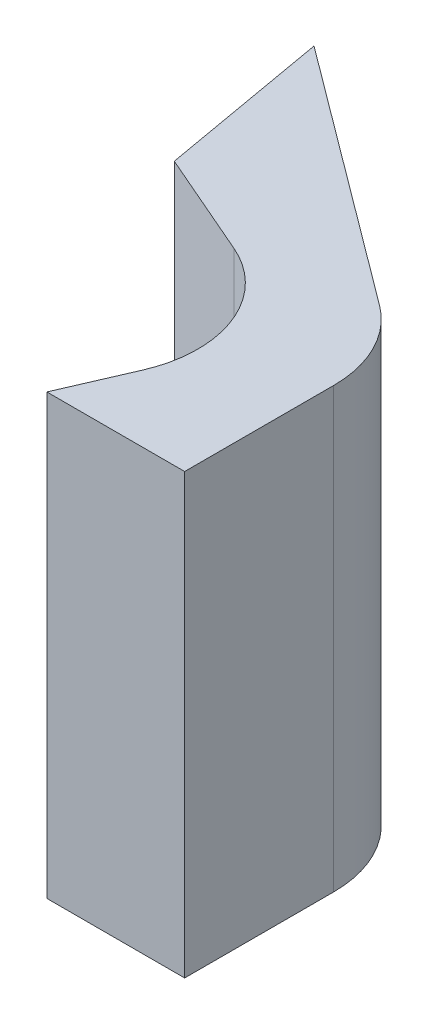
ISO-10303-21;
HEADER;
FILE_DESCRIPTION(('STEP AP214'),'2;1');
FILE_NAME('part.step','',(''),(''),'','','');
FILE_SCHEMA(('AUTOMOTIVE_DESIGN { 1 0 10303 214 1 1 1 1 }'));
ENDSEC;
DATA;
#1=APPLICATION_CONTEXT('core data for automotive mechanical design processes');
#2=APPLICATION_PROTOCOL_DEFINITION('international standard','automotive_design',2000,#1);
#3=PRODUCT_CONTEXT('',#1,'mechanical');
#4=PRODUCT('Part','Part','',(#3));
#5=PRODUCT_RELATED_PRODUCT_CATEGORY('part','',(#4));
#6=PRODUCT_DEFINITION_FORMATION('','',#4);
#7=PRODUCT_DEFINITION_CONTEXT('part definition',#1,'design');
#8=PRODUCT_DEFINITION('design','',#6,#7);
#9=PRODUCT_DEFINITION_SHAPE('','',#8);
#10=(LENGTH_UNIT() NAMED_UNIT(*) SI_UNIT(.MILLI.,.METRE.));
#11=(NAMED_UNIT(*) PLANE_ANGLE_UNIT() SI_UNIT($,.RADIAN.));
#12=(NAMED_UNIT(*) SI_UNIT($,.STERADIAN.) SOLID_ANGLE_UNIT());
#13=UNCERTAINTY_MEASURE_WITH_UNIT(LENGTH_MEASURE(1.E-05),#10,'distance_accuracy_value','');
#14=(GEOMETRIC_REPRESENTATION_CONTEXT(3) GLOBAL_UNCERTAINTY_ASSIGNED_CONTEXT((#13)) GLOBAL_UNIT_ASSIGNED_CONTEXT((#10,
#11,#12)) REPRESENTATION_CONTEXT('',''));
#15=CARTESIAN_POINT('',(0.,0.,0.));
#16=DIRECTION('',(0.,0.,1.));
#17=DIRECTION('',(1.,0.,0.));
#18=AXIS2_PLACEMENT_3D('',#15,#16,#17);
#19=CARTESIAN_POINT('',(2.52335611115016,38.2,-5.82418169498388));
#20=DIRECTION('',(0.917581830501602,0.,0.397546958651841));
#21=DIRECTION('',(0.397546958651842,0.,-0.917581830501602));
#22=AXIS2_PLACEMENT_3D('',#19,#20,#21);
#23=PLANE('',#22);
#24=DIRECTION('',(-0.397546958651841,0.,0.917581830501602));
#25=VECTOR('',#24,1.);
#26=CARTESIAN_POINT('',(2.52335611115016,0.,-5.82418169498388));
#27=LINE('',#26,#25);
#28=CARTESIAN_POINT('',(2.52335611115016,0.,-5.82418169498388));
#29=VERTEX_POINT('',#28);
#30=CARTESIAN_POINT('',(0.,0.,0.));
#31=VERTEX_POINT('',#30);
#32=EDGE_CURVE('E131',#29,#31,#27,.T.);
#33=ORIENTED_EDGE('',*,*,#32,.T.);
#34=DIRECTION('',(0.,-1.,0.));
#35=VECTOR('',#34,1.);
#36=CARTESIAN_POINT('',(0.,38.2,0.));
#37=LINE('',#36,#35);
#38=CARTESIAN_POINT('',(0.,38.2,0.));
#39=VERTEX_POINT('',#38);
#40=EDGE_CURVE('E11',#39,#31,#37,.T.);
#41=ORIENTED_EDGE('',*,*,#40,.F.);
#42=DIRECTION('',(-0.397546958651841,0.,0.917581830501602));
#43=VECTOR('',#42,1.);
#44=CARTESIAN_POINT('',(2.52335611115016,38.2,-5.82418169498388));
#45=LINE('',#44,#43);
#46=CARTESIAN_POINT('',(2.52335611115016,38.2,-5.82418169498388));
#47=VERTEX_POINT('',#46);
#48=EDGE_CURVE('E145',#47,#39,#45,.T.);
#49=ORIENTED_EDGE('',*,*,#48,.F.);
#50=DIRECTION('',(0.,-1.,0.));
#51=VECTOR('',#50,1.);
#52=CARTESIAN_POINT('',(2.52335611115016,38.2,-5.82418169498388));
#53=LINE('',#52,#51);
#54=EDGE_CURVE('E127',#47,#29,#53,.T.);
#55=ORIENTED_EDGE('',*,*,#54,.T.);
#56=EDGE_LOOP('',(#33,#41,#49,#55));
#57=FACE_BOUND('',#56,.T.);
#58=ADVANCED_FACE('F35',(#57),#23,.F.);
#59=CARTESIAN_POINT('',(0.,38.2,0.));
#60=DIRECTION('',(0.,0.,-1.));
#61=DIRECTION('',(-1.,0.,0.));
#62=AXIS2_PLACEMENT_3D('',#59,#60,#61);
#63=PLANE('',#62);
#64=DIRECTION('',(1.,0.,0.));
#65=VECTOR('',#64,1.);
#66=CARTESIAN_POINT('',(0.,0.,0.));
#67=LINE('',#66,#65);
#68=CARTESIAN_POINT('',(12.,0.,0.));
#69=VERTEX_POINT('',#68);
#70=EDGE_CURVE('E134',#31,#69,#67,.T.);
#71=ORIENTED_EDGE('',*,*,#70,.T.);
#72=DIRECTION('',(0.,-1.,0.));
#73=VECTOR('',#72,1.);
#74=CARTESIAN_POINT('',(12.,38.2,0.));
#75=LINE('',#74,#73);
#76=CARTESIAN_POINT('',(12.,38.2,0.));
#77=VERTEX_POINT('',#76);
#78=EDGE_CURVE('E43',#77,#69,#75,.T.);
#79=ORIENTED_EDGE('',*,*,#78,.F.);
#80=DIRECTION('',(1.,0.,0.));
#81=VECTOR('',#80,1.);
#82=CARTESIAN_POINT('',(0.,38.2,0.));
#83=LINE('',#82,#81);
#84=EDGE_CURVE('E94',#39,#77,#83,.T.);
#85=ORIENTED_EDGE('',*,*,#84,.F.);
#86=ORIENTED_EDGE('',*,*,#40,.T.);
#87=EDGE_LOOP('',(#71,#79,#85,#86));
#88=FACE_BOUND('',#87,.T.);
#89=ADVANCED_FACE('F180',(#88),#63,.F.);
#90=CARTESIAN_POINT('',(12.,38.2,0.));
#91=DIRECTION('',(-1.,0.,0.));
#92=DIRECTION('',(0.,0.,1.));
#93=AXIS2_PLACEMENT_3D('',#90,#91,#92);
#94=PLANE('',#93);
#95=DIRECTION('',(0.,0.,-1.));
#96=VECTOR('',#95,1.);
#97=CARTESIAN_POINT('',(12.,0.,0.));
#98=LINE('',#97,#96);
#99=CARTESIAN_POINT('',(12.,0.,-12.981790538806));
#100=VERTEX_POINT('',#99);
#101=EDGE_CURVE('E136',#69,#100,#98,.T.);
#102=ORIENTED_EDGE('',*,*,#101,.T.);
#103=DIRECTION('',(0.,-1.,0.));
#104=VECTOR('',#103,1.);
#105=CARTESIAN_POINT('',(12.,38.2,-12.981790538806));
#106=LINE('',#105,#104);
#107=CARTESIAN_POINT('',(12.,38.2,-12.981790538806));
#108=VERTEX_POINT('',#107);
#109=EDGE_CURVE('E152',#108,#100,#106,.T.);
#110=ORIENTED_EDGE('',*,*,#109,.F.);
#111=DIRECTION('',(0.,0.,-1.));
#112=VECTOR('',#111,1.);
#113=CARTESIAN_POINT('',(12.,38.2,0.));
#114=LINE('',#113,#112);
#115=EDGE_CURVE('E160',#77,#108,#114,.T.);
#116=ORIENTED_EDGE('',*,*,#115,.F.);
#117=ORIENTED_EDGE('',*,*,#78,.T.);
#118=EDGE_LOOP('',(#102,#110,#116,#117));
#119=FACE_BOUND('',#118,.T.);
#120=ADVANCED_FACE('F158',(#119),#94,.F.);
#121=CARTESIAN_POINT('',(2.,38.2,-12.9817905388061));
#122=DIRECTION('',(0.,-1.,0.));
#123=DIRECTION('',(0.,0.,-1.));
#124=AXIS2_PLACEMENT_3D('',#121,#122,#123);
#125=CYLINDRICAL_SURFACE('',#124,10.);
#126=CARTESIAN_POINT('',(2.,0.,-12.9817905388061));
#127=DIRECTION('',(0.,1.,0.));
#128=DIRECTION('',(0.,0.,-1.));
#129=AXIS2_PLACEMENT_3D('',#126,#127,#128);
#130=CIRCLE('',#129,10.);
#131=CARTESIAN_POINT('',(7.97668347521811,0.,-20.9992249561901));
#132=VERTEX_POINT('',#131);
#133=EDGE_CURVE('E138',#100,#132,#130,.T.);
#134=ORIENTED_EDGE('',*,*,#133,.T.);
#135=DIRECTION('',(0.,-1.,0.));
#136=VECTOR('',#135,1.);
#137=CARTESIAN_POINT('',(7.97668347521811,38.2,-20.9992249561901));
#138=LINE('',#137,#136);
#139=CARTESIAN_POINT('',(7.97668347521811,38.2,-20.9992249561901));
#140=VERTEX_POINT('',#139);
#141=EDGE_CURVE('E149',#140,#132,#138,.T.);
#142=ORIENTED_EDGE('',*,*,#141,.F.);
#143=CARTESIAN_POINT('',(2.,38.2,-12.9817905388061));
#144=DIRECTION('',(0.,1.,0.));
#145=DIRECTION('',(0.,0.,-1.));
#146=AXIS2_PLACEMENT_3D('',#143,#144,#145);
#147=CIRCLE('',#146,10.);
#148=EDGE_CURVE('E172',#108,#140,#147,.T.);
#149=ORIENTED_EDGE('',*,*,#148,.F.);
#150=ORIENTED_EDGE('',*,*,#109,.T.);
#151=EDGE_LOOP('',(#134,#142,#149,#150));
#152=FACE_BOUND('',#151,.T.);
#153=ADVANCED_FACE('F168',(#152),#125,.T.);
#154=CARTESIAN_POINT('',(7.97668347521811,38.2,-20.9992249561901));
#155=DIRECTION('',(-0.597668347521815,0.,0.801743441738405));
#156=DIRECTION('',(0.801743441738405,0.,0.597668347521815));
#157=AXIS2_PLACEMENT_3D('',#154,#155,#156);
#158=PLANE('',#157);
#159=DIRECTION('',(-0.801743441738405,0.,-0.597668347521815));
#160=VECTOR('',#159,1.);
#161=CARTESIAN_POINT('',(7.97668347521811,0.,-20.9992249561901));
#162=LINE('',#161,#160);
#163=CARTESIAN_POINT('',(-14.4575335773674,0.,-37.7230554682199));
#164=VERTEX_POINT('',#163);
#165=EDGE_CURVE('E140',#132,#164,#162,.T.);
#166=ORIENTED_EDGE('',*,*,#165,.T.);
#167=DIRECTION('',(0.,-1.,0.));
#168=VECTOR('',#167,1.);
#169=CARTESIAN_POINT('',(-14.4575335773674,38.2,-37.7230554682199));
#170=LINE('',#169,#168);
#171=CARTESIAN_POINT('',(-14.4575335773674,38.2,-37.7230554682199));
#172=VERTEX_POINT('',#171);
#173=EDGE_CURVE('E122',#172,#164,#170,.T.);
#174=ORIENTED_EDGE('',*,*,#173,.F.);
#175=DIRECTION('',(-0.801743441738405,0.,-0.597668347521815));
#176=VECTOR('',#175,1.);
#177=CARTESIAN_POINT('',(7.97668347521811,38.2,-20.9992249561901));
#178=LINE('',#177,#176);
#179=EDGE_CURVE('E113',#140,#172,#178,.T.);
#180=ORIENTED_EDGE('',*,*,#179,.F.);
#181=ORIENTED_EDGE('',*,*,#141,.T.);
#182=EDGE_LOOP('',(#166,#174,#180,#181));
#183=FACE_BOUND('',#182,.T.);
#184=ADVANCED_FACE('F171',(#183),#158,.F.);
#185=CARTESIAN_POINT('',(-14.4575335773674,38.2,-37.7230554682199));
#186=DIRECTION('',(0.984807753012208,0.,-0.173648177666927));
#187=DIRECTION('',(-0.173648177666927,0.,-0.984807753012209));
#188=AXIS2_PLACEMENT_3D('',#185,#186,#187);
#189=PLANE('',#188);
#190=DIRECTION('',(0.173648177666927,0.,0.984807753012208));
#191=VECTOR('',#190,1.);
#192=CARTESIAN_POINT('',(-14.4575335773674,0.,-37.7230554682199));
#193=LINE('',#192,#191);
#194=CARTESIAN_POINT('',(-11.8528109123635,0.,-22.9509391730368));
#195=VERTEX_POINT('',#194);
#196=EDGE_CURVE('E121',#164,#195,#193,.T.);
#197=ORIENTED_EDGE('',*,*,#196,.T.);
#198=DIRECTION('',(0.,-1.,0.));
#199=VECTOR('',#198,1.);
#200=CARTESIAN_POINT('',(-11.8528109123635,38.2,-22.9509391730368));
#201=LINE('',#200,#199);
#202=CARTESIAN_POINT('',(-11.8528109123635,38.2,-22.9509391730368));
#203=VERTEX_POINT('',#202);
#204=EDGE_CURVE('E118',#203,#195,#201,.T.);
#205=ORIENTED_EDGE('',*,*,#204,.F.);
#206=DIRECTION('',(0.173648177666927,0.,0.984807753012208));
#207=VECTOR('',#206,1.);
#208=CARTESIAN_POINT('',(-14.4575335773674,38.2,-37.7230554682199));
#209=LINE('',#208,#207);
#210=EDGE_CURVE('E107',#172,#203,#209,.T.);
#211=ORIENTED_EDGE('',*,*,#210,.F.);
#212=ORIENTED_EDGE('',*,*,#173,.T.);
#213=EDGE_LOOP('',(#197,#205,#211,#212));
#214=FACE_BOUND('',#213,.T.);
#215=ADVANCED_FACE('F119',(#214),#189,.F.);
#216=CARTESIAN_POINT('',(-11.8528109123635,38.2,-22.9509391730368));
#217=DIRECTION('',(0.397546958651838,0.,-0.917581830501604));
#218=DIRECTION('',(-0.917581830501604,0.,-0.397546958651838));
#219=AXIS2_PLACEMENT_3D('',#216,#217,#218);
#220=PLANE('',#219);
#221=DIRECTION('',(0.917581830501603,0.,0.397546958651838));
#222=VECTOR('',#221,1.);
#223=CARTESIAN_POINT('',(-11.8528109123635,0.,-22.9509391730368));
#224=LINE('',#223,#222);
#225=CARTESIAN_POINT('',(-2.67699260734752,0.,-18.9754695865184));
#226=VERTEX_POINT('',#225);
#227=EDGE_CURVE('E80',#195,#226,#224,.T.);
#228=ORIENTED_EDGE('',*,*,#227,.T.);
#229=DIRECTION('',(0.,-1.,0.));
#230=VECTOR('',#229,1.);
#231=CARTESIAN_POINT('',(-2.67699260734752,38.2,-18.9754695865184));
#232=LINE('',#231,#230);
#233=CARTESIAN_POINT('',(-2.67699260734752,38.2,-18.9754695865184));
#234=VERTEX_POINT('',#233);
#235=EDGE_CURVE('E123',#234,#226,#232,.T.);
#236=ORIENTED_EDGE('',*,*,#235,.F.);
#237=DIRECTION('',(0.917581830501603,0.,0.397546958651838));
#238=VECTOR('',#237,1.);
#239=CARTESIAN_POINT('',(-11.8528109123635,38.2,-22.9509391730368));
#240=LINE('',#239,#238);
#241=EDGE_CURVE('E111',#203,#234,#240,.T.);
#242=ORIENTED_EDGE('',*,*,#241,.F.);
#243=ORIENTED_EDGE('',*,*,#204,.T.);
#244=EDGE_LOOP('',(#228,#236,#242,#243));
#245=FACE_BOUND('',#244,.T.);
#246=ADVANCED_FACE('F125',(#245),#220,.F.);
#247=CARTESIAN_POINT('',(-6.65246219386583,38.2,-9.79965128150236));
#248=DIRECTION('',(0.,-1.,0.));
#249=DIRECTION('',(0.,0.,-1.));
#250=AXIS2_PLACEMENT_3D('',#247,#248,#249);
#251=CYLINDRICAL_SURFACE('',#250,10.);
#252=CARTESIAN_POINT('',(-6.65246219386583,0.,-9.79965128150236));
#253=DIRECTION('',(0.,-1.,0.));
#254=DIRECTION('',(0.,0.,1.));
#255=AXIS2_PLACEMENT_3D('',#252,#253,#254);
#256=CIRCLE('',#255,10.);
#257=EDGE_CURVE('E86',#226,#29,#256,.T.);
#258=ORIENTED_EDGE('',*,*,#257,.T.);
#259=ORIENTED_EDGE('',*,*,#54,.F.);
#260=CARTESIAN_POINT('',(-6.65246219386583,38.2,-9.79965128150236));
#261=DIRECTION('',(0.,-1.,0.));
#262=DIRECTION('',(0.,0.,1.));
#263=AXIS2_PLACEMENT_3D('',#260,#261,#262);
#264=CIRCLE('',#263,10.);
#265=EDGE_CURVE('E51',#234,#47,#264,.T.);
#266=ORIENTED_EDGE('',*,*,#265,.F.);
#267=ORIENTED_EDGE('',*,*,#235,.T.);
#268=EDGE_LOOP('',(#258,#259,#266,#267));
#269=FACE_BOUND('',#268,.T.);
#270=ADVANCED_FACE('F196',(#269),#251,.F.);
#271=CARTESIAN_POINT('',(2.,38.2,-12.9817905388061));
#272=DIRECTION('',(0.,-1.,0.));
#273=DIRECTION('',(0.,0.,-1.));
#274=AXIS2_PLACEMENT_3D('',#271,#272,#273);
#275=PLANE('',#274);
#276=ORIENTED_EDGE('',*,*,#48,.T.);
#277=ORIENTED_EDGE('',*,*,#84,.T.);
#278=ORIENTED_EDGE('',*,*,#115,.T.);
#279=ORIENTED_EDGE('',*,*,#148,.T.);
#280=ORIENTED_EDGE('',*,*,#179,.T.);
#281=ORIENTED_EDGE('',*,*,#210,.T.);
#282=ORIENTED_EDGE('',*,*,#241,.T.);
#283=ORIENTED_EDGE('',*,*,#265,.T.);
#284=EDGE_LOOP('',(#276,#277,#278,#279,#280,#281,#282,#283));
#285=FACE_BOUND('',#284,.T.);
#286=ADVANCED_FACE('F109',(#285),#275,.F.);
#287=CARTESIAN_POINT('',(2.,0.,-12.9817905388061));
#288=DIRECTION('',(0.,-1.,0.));
#289=DIRECTION('',(0.,0.,-1.));
#290=AXIS2_PLACEMENT_3D('',#287,#288,#289);
#291=PLANE('',#290);
#292=ORIENTED_EDGE('',*,*,#32,.F.);
#293=ORIENTED_EDGE('',*,*,#257,.F.);
#294=ORIENTED_EDGE('',*,*,#227,.F.);
#295=ORIENTED_EDGE('',*,*,#196,.F.);
#296=ORIENTED_EDGE('',*,*,#165,.F.);
#297=ORIENTED_EDGE('',*,*,#133,.F.);
#298=ORIENTED_EDGE('',*,*,#101,.F.);
#299=ORIENTED_EDGE('',*,*,#70,.F.);
#300=EDGE_LOOP('',(#292,#293,#294,#295,#296,#297,#298,#299));
#301=FACE_BOUND('',#300,.T.);
#302=ADVANCED_FACE('F164',(#301),#291,.T.);
#303=CLOSED_SHELL('',(#58,#89,#120,#153,#184,#215,#246,#270,#286,#302));
#304=MANIFOLD_SOLID_BREP('B2',#303);
#305=ADVANCED_BREP_SHAPE_REPRESENTATION('',(#18,#304),#14);
#306=SHAPE_DEFINITION_REPRESENTATION(#9,#305);
ENDSEC;
END-ISO-10303-21;
